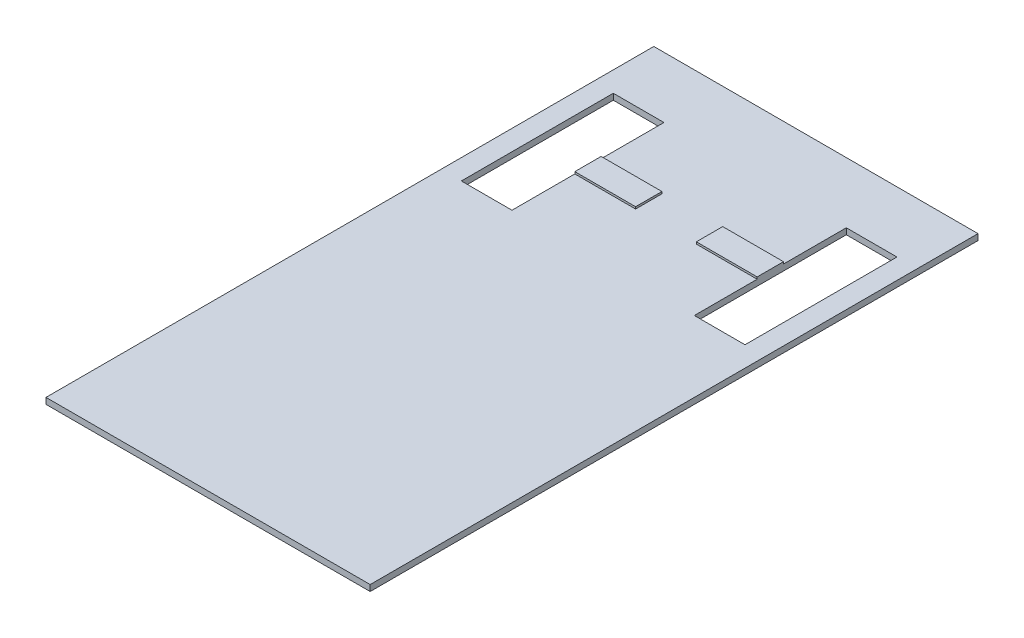
ISO-10303-21;
HEADER;
FILE_DESCRIPTION(('STEP AP214'),'2;1');
FILE_NAME('part.step','',(''),(''),'','','');
FILE_SCHEMA(('AUTOMOTIVE_DESIGN { 1 0 10303 214 1 1 1 1 }'));
ENDSEC;
DATA;
#1=APPLICATION_CONTEXT('core data for automotive mechanical design processes');
#2=APPLICATION_PROTOCOL_DEFINITION('international standard','automotive_design',2000,#1);
#3=PRODUCT_CONTEXT('',#1,'mechanical');
#4=PRODUCT('Part','Part','',(#3));
#5=PRODUCT_RELATED_PRODUCT_CATEGORY('part','',(#4));
#6=PRODUCT_DEFINITION_FORMATION('','',#4);
#7=PRODUCT_DEFINITION_CONTEXT('part definition',#1,'design');
#8=PRODUCT_DEFINITION('design','',#6,#7);
#9=PRODUCT_DEFINITION_SHAPE('','',#8);
#10=(LENGTH_UNIT() NAMED_UNIT(*) SI_UNIT(.MILLI.,.METRE.));
#11=(NAMED_UNIT(*) PLANE_ANGLE_UNIT() SI_UNIT($,.RADIAN.));
#12=(NAMED_UNIT(*) SI_UNIT($,.STERADIAN.) SOLID_ANGLE_UNIT());
#13=UNCERTAINTY_MEASURE_WITH_UNIT(LENGTH_MEASURE(1.E-05),#10,'distance_accuracy_value','');
#14=(GEOMETRIC_REPRESENTATION_CONTEXT(3) GLOBAL_UNCERTAINTY_ASSIGNED_CONTEXT((#13)) GLOBAL_UNIT_ASSIGNED_CONTEXT((#10,
#11,#12)) REPRESENTATION_CONTEXT('',''));
#15=CARTESIAN_POINT('',(0.,0.,0.));
#16=DIRECTION('',(0.,0.,1.));
#17=DIRECTION('',(1.,0.,0.));
#18=AXIS2_PLACEMENT_3D('',#15,#16,#17);
#19=CARTESIAN_POINT('',(2.46516211719598E-13,3.,44.4084127696466));
#20=DIRECTION('',(0.,0.,-1.));
#21=DIRECTION('',(-1.,0.,0.));
#22=AXIS2_PLACEMENT_3D('',#19,#20,#21);
#23=PLANE('',#22);
#24=DIRECTION('',(1.,0.,0.));
#25=VECTOR('',#24,1.);
#26=CARTESIAN_POINT('',(2.46516211719598E-13,0.,44.4084127696466));
#27=LINE('',#26,#25);
#28=CARTESIAN_POINT('',(50.4857649515051,0.,44.4084127696464));
#29=VERTEX_POINT('',#28);
#30=CARTESIAN_POINT('',(75.4857649515051,0.,44.4084127696462));
#31=VERTEX_POINT('',#30);
#32=EDGE_CURVE('E155',#29,#31,#27,.T.);
#33=ORIENTED_EDGE('',*,*,#32,.F.);
#34=DIRECTION('',(0.,-1.,0.));
#35=VECTOR('',#34,1.);
#36=CARTESIAN_POINT('',(50.4857649515051,3.,44.4084127696464));
#37=LINE('',#36,#35);
#38=CARTESIAN_POINT('',(50.4857649515051,3.,44.4084127696464));
#39=VERTEX_POINT('',#38);
#40=EDGE_CURVE('E49',#39,#29,#37,.T.);
#41=ORIENTED_EDGE('',*,*,#40,.F.);
#42=DIRECTION('',(1.,0.,0.));
#43=VECTOR('',#42,1.);
#44=CARTESIAN_POINT('',(2.46516211719598E-13,3.,44.4084127696466));
#45=LINE('',#44,#43);
#46=CARTESIAN_POINT('',(75.4857649515051,3.,44.4084127696462));
#47=VERTEX_POINT('',#46);
#48=EDGE_CURVE('E153',#39,#47,#45,.T.);
#49=ORIENTED_EDGE('',*,*,#48,.T.);
#50=DIRECTION('',(0.,-1.,0.));
#51=VECTOR('',#50,1.);
#52=CARTESIAN_POINT('',(75.4857649515051,3.,44.4084127696462));
#53=LINE('',#52,#51);
#54=EDGE_CURVE('E11',#47,#31,#53,.T.);
#55=ORIENTED_EDGE('',*,*,#54,.T.);
#56=EDGE_LOOP('',(#33,#41,#49,#55));
#57=FACE_BOUND('',#56,.T.);
#58=ADVANCED_FACE('F39',(#57),#23,.T.);
#59=CARTESIAN_POINT('',(50.4857649515051,3.,0.));
#60=DIRECTION('',(1.,0.,0.));
#61=DIRECTION('',(0.,0.,-1.));
#62=AXIS2_PLACEMENT_3D('',#59,#60,#61);
#63=PLANE('',#62);
#64=DIRECTION('',(0.,0.,1.));
#65=VECTOR('',#64,1.);
#66=CARTESIAN_POINT('',(50.4857649515051,0.,0.));
#67=LINE('',#66,#65);
#68=CARTESIAN_POINT('',(50.4857649515051,0.,-30.5915872303536));
#69=VERTEX_POINT('',#68);
#70=EDGE_CURVE('E202',#69,#29,#67,.T.);
#71=ORIENTED_EDGE('',*,*,#70,.F.);
#72=DIRECTION('',(0.,-1.,0.));
#73=VECTOR('',#72,1.);
#74=CARTESIAN_POINT('',(50.4857649515051,3.,-30.5915872303536));
#75=LINE('',#74,#73);
#76=CARTESIAN_POINT('',(50.4857649515051,3.,-30.5915872303536));
#77=VERTEX_POINT('',#76);
#78=EDGE_CURVE('E99',#77,#69,#75,.T.);
#79=ORIENTED_EDGE('',*,*,#78,.F.);
#80=DIRECTION('',(0.,0.,1.));
#81=VECTOR('',#80,1.);
#82=CARTESIAN_POINT('',(50.4857649515051,3.,0.));
#83=LINE('',#82,#81);
#84=EDGE_CURVE('E163',#77,#39,#83,.T.);
#85=ORIENTED_EDGE('',*,*,#84,.T.);
#86=ORIENTED_EDGE('',*,*,#40,.T.);
#87=EDGE_LOOP('',(#71,#79,#85,#86));
#88=FACE_BOUND('',#87,.T.);
#89=ADVANCED_FACE('F169',(#88),#63,.T.);
#90=CARTESIAN_POINT('',(0.,3.,-30.5915872303536));
#91=DIRECTION('',(0.,0.,-1.));
#92=DIRECTION('',(-1.,0.,0.));
#93=AXIS2_PLACEMENT_3D('',#90,#91,#92);
#94=PLANE('',#93);
#95=DIRECTION('',(1.,0.,0.));
#96=VECTOR('',#95,1.);
#97=CARTESIAN_POINT('',(0.,0.,-30.5915872303536));
#98=LINE('',#97,#96);
#99=CARTESIAN_POINT('',(75.4857649515051,0.,-30.5915872303536));
#100=VERTEX_POINT('',#99);
#101=EDGE_CURVE('E102',#69,#100,#98,.T.);
#102=ORIENTED_EDGE('',*,*,#101,.T.);
#103=DIRECTION('',(0.,-1.,0.));
#104=VECTOR('',#103,1.);
#105=CARTESIAN_POINT('',(75.4857649515051,3.,-30.5915872303536));
#106=LINE('',#105,#104);
#107=CARTESIAN_POINT('',(75.4857649515051,3.,-30.5915872303536));
#108=VERTEX_POINT('',#107);
#109=EDGE_CURVE('E205',#108,#100,#106,.T.);
#110=ORIENTED_EDGE('',*,*,#109,.F.);
#111=DIRECTION('',(1.,0.,0.));
#112=VECTOR('',#111,1.);
#113=CARTESIAN_POINT('',(0.,3.,-30.5915872303536));
#114=LINE('',#113,#112);
#115=EDGE_CURVE('E58',#77,#108,#114,.T.);
#116=ORIENTED_EDGE('',*,*,#115,.F.);
#117=ORIENTED_EDGE('',*,*,#78,.T.);
#118=EDGE_LOOP('',(#102,#110,#116,#117));
#119=FACE_BOUND('',#118,.T.);
#120=ADVANCED_FACE('F371',(#119),#94,.F.);
#121=CARTESIAN_POINT('',(200.485764951505,3.,0.));
#122=DIRECTION('',(1.,0.,0.));
#123=DIRECTION('',(0.,0.,-1.));
#124=AXIS2_PLACEMENT_3D('',#121,#122,#123);
#125=PLANE('',#124);
#126=DIRECTION('',(0.,0.,1.));
#127=VECTOR('',#126,1.);
#128=CARTESIAN_POINT('',(200.485764951505,0.,0.));
#129=LINE('',#128,#127);
#130=CARTESIAN_POINT('',(200.485764951505,0.,-60.5915872303536));
#131=VERTEX_POINT('',#130);
#132=CARTESIAN_POINT('',(200.485764951505,0.,239.408412769646));
#133=VERTEX_POINT('',#132);
#134=EDGE_CURVE('E178',#131,#133,#129,.T.);
#135=ORIENTED_EDGE('',*,*,#134,.F.);
#136=DIRECTION('',(0.,-1.,0.));
#137=VECTOR('',#136,1.);
#138=CARTESIAN_POINT('',(200.485764951505,3.,-60.5915872303536));
#139=LINE('',#138,#137);
#140=CARTESIAN_POINT('',(200.485764951505,3.,-60.5915872303536));
#141=VERTEX_POINT('',#140);
#142=EDGE_CURVE('E207',#141,#131,#139,.T.);
#143=ORIENTED_EDGE('',*,*,#142,.F.);
#144=DIRECTION('',(0.,0.,1.));
#145=VECTOR('',#144,1.);
#146=CARTESIAN_POINT('',(200.485764951505,3.,0.));
#147=LINE('',#146,#145);
#148=CARTESIAN_POINT('',(200.485764951505,3.,239.408412769646));
#149=VERTEX_POINT('',#148);
#150=EDGE_CURVE('E256',#141,#149,#147,.T.);
#151=ORIENTED_EDGE('',*,*,#150,.T.);
#152=DIRECTION('',(0.,-1.,0.));
#153=VECTOR('',#152,1.);
#154=CARTESIAN_POINT('',(200.485764951505,3.,239.408412769646));
#155=LINE('',#154,#153);
#156=EDGE_CURVE('E209',#149,#133,#155,.T.);
#157=ORIENTED_EDGE('',*,*,#156,.T.);
#158=EDGE_LOOP('',(#135,#143,#151,#157));
#159=FACE_BOUND('',#158,.T.);
#160=ADVANCED_FACE('F386',(#159),#125,.T.);
#161=CARTESIAN_POINT('',(0.,3.,-60.5915872303536));
#162=DIRECTION('',(0.,0.,-1.));
#163=DIRECTION('',(-1.,0.,0.));
#164=AXIS2_PLACEMENT_3D('',#161,#162,#163);
#165=PLANE('',#164);
#166=DIRECTION('',(1.,0.,0.));
#167=VECTOR('',#166,1.);
#168=CARTESIAN_POINT('',(0.,0.,-60.5915872303536));
#169=LINE('',#168,#167);
#170=CARTESIAN_POINT('',(40.4857649515051,0.,-60.5915872303536));
#171=VERTEX_POINT('',#170);
#172=EDGE_CURVE('E190',#171,#131,#169,.T.);
#173=ORIENTED_EDGE('',*,*,#172,.F.);
#174=DIRECTION('',(0.,-1.,0.));
#175=VECTOR('',#174,1.);
#176=CARTESIAN_POINT('',(40.4857649515051,3.,-60.5915872303536));
#177=LINE('',#176,#175);
#178=CARTESIAN_POINT('',(40.4857649515051,3.,-60.5915872303536));
#179=VERTEX_POINT('',#178);
#180=EDGE_CURVE('E214',#179,#171,#177,.T.);
#181=ORIENTED_EDGE('',*,*,#180,.F.);
#182=DIRECTION('',(1.,0.,0.));
#183=VECTOR('',#182,1.);
#184=CARTESIAN_POINT('',(0.,3.,-60.5915872303536));
#185=LINE('',#184,#183);
#186=EDGE_CURVE('E259',#179,#141,#185,.T.);
#187=ORIENTED_EDGE('',*,*,#186,.T.);
#188=ORIENTED_EDGE('',*,*,#142,.T.);
#189=EDGE_LOOP('',(#173,#181,#187,#188));
#190=FACE_BOUND('',#189,.T.);
#191=ADVANCED_FACE('F382',(#190),#165,.T.);
#192=CARTESIAN_POINT('',(40.4857649515051,3.,0.));
#193=DIRECTION('',(1.,0.,0.));
#194=DIRECTION('',(0.,0.,-1.));
#195=AXIS2_PLACEMENT_3D('',#192,#193,#194);
#196=PLANE('',#195);
#197=DIRECTION('',(0.,0.,1.));
#198=VECTOR('',#197,1.);
#199=CARTESIAN_POINT('',(40.4857649515051,0.,0.));
#200=LINE('',#199,#198);
#201=CARTESIAN_POINT('',(40.4857649515052,0.,239.408412769646));
#202=VERTEX_POINT('',#201);
#203=EDGE_CURVE('E193',#171,#202,#200,.T.);
#204=ORIENTED_EDGE('',*,*,#203,.T.);
#205=DIRECTION('',(0.,-1.,0.));
#206=VECTOR('',#205,1.);
#207=CARTESIAN_POINT('',(40.4857649515052,3.,239.408412769646));
#208=LINE('',#207,#206);
#209=CARTESIAN_POINT('',(40.4857649515052,3.,239.408412769646));
#210=VERTEX_POINT('',#209);
#211=EDGE_CURVE('E211',#210,#202,#208,.T.);
#212=ORIENTED_EDGE('',*,*,#211,.F.);
#213=DIRECTION('',(0.,0.,1.));
#214=VECTOR('',#213,1.);
#215=CARTESIAN_POINT('',(40.4857649515051,3.,0.));
#216=LINE('',#215,#214);
#217=EDGE_CURVE('E262',#179,#210,#216,.T.);
#218=ORIENTED_EDGE('',*,*,#217,.F.);
#219=ORIENTED_EDGE('',*,*,#180,.T.);
#220=EDGE_LOOP('',(#204,#212,#218,#219));
#221=FACE_BOUND('',#220,.T.);
#222=ADVANCED_FACE('F379',(#221),#196,.F.);
#223=CARTESIAN_POINT('',(0.,3.,-30.5915872303536));
#224=DIRECTION('',(0.,0.,-1.));
#225=DIRECTION('',(-1.,0.,0.));
#226=AXIS2_PLACEMENT_3D('',#223,#224,#225);
#227=PLANE('',#226);
#228=DIRECTION('',(1.,0.,0.));
#229=VECTOR('',#228,1.);
#230=CARTESIAN_POINT('',(0.,0.,-30.5915872303536));
#231=LINE('',#230,#229);
#232=CARTESIAN_POINT('',(165.485764951505,0.,-30.5915872303536));
#233=VERTEX_POINT('',#232);
#234=CARTESIAN_POINT('',(190.485764951505,0.,-30.5915872303536));
#235=VERTEX_POINT('',#234);
#236=EDGE_CURVE('E180',#233,#235,#231,.T.);
#237=ORIENTED_EDGE('',*,*,#236,.T.);
#238=DIRECTION('',(0.,-1.,0.));
#239=VECTOR('',#238,1.);
#240=CARTESIAN_POINT('',(190.485764951505,3.,-30.5915872303536));
#241=LINE('',#240,#239);
#242=CARTESIAN_POINT('',(190.485764951505,3.,-30.5915872303536));
#243=VERTEX_POINT('',#242);
#244=EDGE_CURVE('E220',#243,#235,#241,.T.);
#245=ORIENTED_EDGE('',*,*,#244,.F.);
#246=DIRECTION('',(1.,0.,0.));
#247=VECTOR('',#246,1.);
#248=CARTESIAN_POINT('',(0.,3.,-30.5915872303536));
#249=LINE('',#248,#247);
#250=CARTESIAN_POINT('',(165.485764951505,3.,-30.5915872303536));
#251=VERTEX_POINT('',#250);
#252=EDGE_CURVE('E230',#251,#243,#249,.T.);
#253=ORIENTED_EDGE('',*,*,#252,.F.);
#254=DIRECTION('',(0.,-1.,0.));
#255=VECTOR('',#254,1.);
#256=CARTESIAN_POINT('',(165.485764951505,3.,-30.5915872303536));
#257=LINE('',#256,#255);
#258=EDGE_CURVE('E43',#251,#233,#257,.T.);
#259=ORIENTED_EDGE('',*,*,#258,.T.);
#260=EDGE_LOOP('',(#237,#245,#253,#259));
#261=FACE_BOUND('',#260,.T.);
#262=ADVANCED_FACE('F41',(#261),#227,.F.);
#263=CARTESIAN_POINT('',(190.485764951505,3.,0.));
#264=DIRECTION('',(1.,0.,0.));
#265=DIRECTION('',(0.,0.,-1.));
#266=AXIS2_PLACEMENT_3D('',#263,#264,#265);
#267=PLANE('',#266);
#268=DIRECTION('',(0.,0.,1.));
#269=VECTOR('',#268,1.);
#270=CARTESIAN_POINT('',(190.485764951505,0.,0.));
#271=LINE('',#270,#269);
#272=CARTESIAN_POINT('',(190.485764951505,0.,44.4084127696464));
#273=VERTEX_POINT('',#272);
#274=EDGE_CURVE('E182',#235,#273,#271,.T.);
#275=ORIENTED_EDGE('',*,*,#274,.T.);
#276=DIRECTION('',(0.,-1.,0.));
#277=VECTOR('',#276,1.);
#278=CARTESIAN_POINT('',(190.485764951505,3.,44.4084127696464));
#279=LINE('',#278,#277);
#280=CARTESIAN_POINT('',(190.485764951505,3.,44.4084127696464));
#281=VERTEX_POINT('',#280);
#282=EDGE_CURVE('E219',#281,#273,#279,.T.);
#283=ORIENTED_EDGE('',*,*,#282,.F.);
#284=DIRECTION('',(0.,0.,1.));
#285=VECTOR('',#284,1.);
#286=CARTESIAN_POINT('',(190.485764951505,3.,0.));
#287=LINE('',#286,#285);
#288=EDGE_CURVE('E241',#243,#281,#287,.T.);
#289=ORIENTED_EDGE('',*,*,#288,.F.);
#290=ORIENTED_EDGE('',*,*,#244,.T.);
#291=EDGE_LOOP('',(#275,#283,#289,#290));
#292=FACE_BOUND('',#291,.T.);
#293=ADVANCED_FACE('F239',(#292),#267,.F.);
#294=CARTESIAN_POINT('',(0.,3.,44.4084127696464));
#295=DIRECTION('',(0.,0.,-1.));
#296=DIRECTION('',(-1.,0.,0.));
#297=AXIS2_PLACEMENT_3D('',#294,#295,#296);
#298=PLANE('',#297);
#299=DIRECTION('',(1.,0.,0.));
#300=VECTOR('',#299,1.);
#301=CARTESIAN_POINT('',(0.,0.,44.4084127696464));
#302=LINE('',#301,#300);
#303=CARTESIAN_POINT('',(165.485764951505,0.,44.4084127696464));
#304=VERTEX_POINT('',#303);
#305=EDGE_CURVE('E179',#304,#273,#302,.T.);
#306=ORIENTED_EDGE('',*,*,#305,.F.);
#307=DIRECTION('',(0.,-1.,0.));
#308=VECTOR('',#307,1.);
#309=CARTESIAN_POINT('',(165.485764951505,3.,44.4084127696464));
#310=LINE('',#309,#308);
#311=CARTESIAN_POINT('',(165.485764951505,3.,44.4084127696464));
#312=VERTEX_POINT('',#311);
#313=EDGE_CURVE('E217',#312,#304,#310,.T.);
#314=ORIENTED_EDGE('',*,*,#313,.F.);
#315=DIRECTION('',(1.,0.,0.));
#316=VECTOR('',#315,1.);
#317=CARTESIAN_POINT('',(0.,3.,44.4084127696464));
#318=LINE('',#317,#316);
#319=EDGE_CURVE('E244',#312,#281,#318,.T.);
#320=ORIENTED_EDGE('',*,*,#319,.T.);
#321=ORIENTED_EDGE('',*,*,#282,.T.);
#322=EDGE_LOOP('',(#306,#314,#320,#321));
#323=FACE_BOUND('',#322,.T.);
#324=ADVANCED_FACE('F245',(#323),#298,.T.);
#325=CARTESIAN_POINT('',(165.485764951505,3.,0.));
#326=DIRECTION('',(1.,0.,0.));
#327=DIRECTION('',(0.,0.,-1.));
#328=AXIS2_PLACEMENT_3D('',#325,#326,#327);
#329=PLANE('',#328);
#330=DIRECTION('',(0.,0.,1.));
#331=VECTOR('',#330,1.);
#332=CARTESIAN_POINT('',(165.485764951505,0.,0.));
#333=LINE('',#332,#331);
#334=EDGE_CURVE('E175',#233,#304,#333,.T.);
#335=ORIENTED_EDGE('',*,*,#334,.F.);
#336=ORIENTED_EDGE('',*,*,#258,.F.);
#337=DIRECTION('',(0.,0.,1.));
#338=VECTOR('',#337,1.);
#339=CARTESIAN_POINT('',(165.485764951505,3.,0.));
#340=LINE('',#339,#338);
#341=CARTESIAN_POINT('',(165.485764951505,3.,0.408412769646361));
#342=VERTEX_POINT('',#341);
#343=EDGE_CURVE('E251',#251,#342,#340,.T.);
#344=ORIENTED_EDGE('',*,*,#343,.T.);
#345=DIRECTION('',(0.,-1.,0.));
#346=VECTOR('',#345,1.);
#347=CARTESIAN_POINT('',(165.485764951505,4.,0.408412769646361));
#348=LINE('',#347,#346);
#349=CARTESIAN_POINT('',(165.485764951505,4.,0.408412769646361));
#350=VERTEX_POINT('',#349);
#351=EDGE_CURVE('E309',#350,#342,#348,.T.);
#352=ORIENTED_EDGE('',*,*,#351,.F.);
#353=DIRECTION('',(0.,0.,1.));
#354=VECTOR('',#353,1.);
#355=CARTESIAN_POINT('',(165.485764951505,4.,0.));
#356=LINE('',#355,#354);
#357=CARTESIAN_POINT('',(165.485764951505,4.,13.4084127696464));
#358=VERTEX_POINT('',#357);
#359=EDGE_CURVE('E319',#350,#358,#356,.T.);
#360=ORIENTED_EDGE('',*,*,#359,.T.);
#361=DIRECTION('',(0.,-1.,0.));
#362=VECTOR('',#361,1.);
#363=CARTESIAN_POINT('',(165.485764951505,4.,13.4084127696464));
#364=LINE('',#363,#362);
#365=CARTESIAN_POINT('',(165.485764951505,3.,13.4084127696464));
#366=VERTEX_POINT('',#365);
#367=EDGE_CURVE('E318',#358,#366,#364,.T.);
#368=ORIENTED_EDGE('',*,*,#367,.T.);
#369=EDGE_CURVE('E247',#366,#312,#340,.T.);
#370=ORIENTED_EDGE('',*,*,#369,.T.);
#371=ORIENTED_EDGE('',*,*,#313,.T.);
#372=EDGE_LOOP('',(#335,#336,#344,#352,#360,#368,#370,#371));
#373=FACE_BOUND('',#372,.T.);
#374=ADVANCED_FACE('F306',(#373),#329,.T.);
#375=CARTESIAN_POINT('',(0.,3.,239.408412769646));
#376=DIRECTION('',(0.,0.,-1.));
#377=DIRECTION('',(-1.,0.,0.));
#378=AXIS2_PLACEMENT_3D('',#375,#376,#377);
#379=PLANE('',#378);
#380=DIRECTION('',(1.,0.,0.));
#381=VECTOR('',#380,1.);
#382=CARTESIAN_POINT('',(0.,0.,239.408412769646));
#383=LINE('',#382,#381);
#384=EDGE_CURVE('E196',#202,#133,#383,.T.);
#385=ORIENTED_EDGE('',*,*,#384,.T.);
#386=ORIENTED_EDGE('',*,*,#156,.F.);
#387=DIRECTION('',(1.,0.,0.));
#388=VECTOR('',#387,1.);
#389=CARTESIAN_POINT('',(0.,3.,239.408412769646));
#390=LINE('',#389,#388);
#391=EDGE_CURVE('E265',#210,#149,#390,.T.);
#392=ORIENTED_EDGE('',*,*,#391,.F.);
#393=ORIENTED_EDGE('',*,*,#211,.T.);
#394=EDGE_LOOP('',(#385,#386,#392,#393));
#395=FACE_BOUND('',#394,.T.);
#396=ADVANCED_FACE('F375',(#395),#379,.F.);
#397=CARTESIAN_POINT('',(75.4857649515051,3.,0.));
#398=DIRECTION('',(1.,0.,0.));
#399=DIRECTION('',(0.,0.,-1.));
#400=AXIS2_PLACEMENT_3D('',#397,#398,#399);
#401=PLANE('',#400);
#402=DIRECTION('',(0.,0.,1.));
#403=VECTOR('',#402,1.);
#404=CARTESIAN_POINT('',(75.4857649515051,0.,0.));
#405=LINE('',#404,#403);
#406=EDGE_CURVE('E199',#100,#31,#405,.T.);
#407=ORIENTED_EDGE('',*,*,#406,.T.);
#408=ORIENTED_EDGE('',*,*,#54,.F.);
#409=DIRECTION('',(0.,0.,1.));
#410=VECTOR('',#409,1.);
#411=CARTESIAN_POINT('',(75.4857649515051,3.,0.));
#412=LINE('',#411,#410);
#413=CARTESIAN_POINT('',(75.4857649515051,3.,13.4084127696463));
#414=VERTEX_POINT('',#413);
#415=EDGE_CURVE('E166',#414,#47,#412,.T.);
#416=ORIENTED_EDGE('',*,*,#415,.F.);
#417=DIRECTION('',(0.,-1.,0.));
#418=VECTOR('',#417,1.);
#419=CARTESIAN_POINT('',(75.4857649515051,4.,13.4084127696463));
#420=LINE('',#419,#418);
#421=CARTESIAN_POINT('',(75.4857649515051,4.,13.4084127696463));
#422=VERTEX_POINT('',#421);
#423=EDGE_CURVE('E292',#422,#414,#420,.T.);
#424=ORIENTED_EDGE('',*,*,#423,.F.);
#425=DIRECTION('',(0.,0.,1.));
#426=VECTOR('',#425,1.);
#427=CARTESIAN_POINT('',(75.4857649515051,4.,0.));
#428=LINE('',#427,#426);
#429=CARTESIAN_POINT('',(75.4857649515051,4.,0.40841276964629));
#430=VERTEX_POINT('',#429);
#431=EDGE_CURVE('E288',#430,#422,#428,.T.);
#432=ORIENTED_EDGE('',*,*,#431,.F.);
#433=DIRECTION('',(0.,-1.,0.));
#434=VECTOR('',#433,1.);
#435=CARTESIAN_POINT('',(75.4857649515051,4.,0.40841276964629));
#436=LINE('',#435,#434);
#437=CARTESIAN_POINT('',(75.4857649515051,3.,0.40841276964629));
#438=VERTEX_POINT('',#437);
#439=EDGE_CURVE('E284',#430,#438,#436,.T.);
#440=ORIENTED_EDGE('',*,*,#439,.T.);
#441=EDGE_CURVE('E171',#108,#438,#412,.T.);
#442=ORIENTED_EDGE('',*,*,#441,.F.);
#443=ORIENTED_EDGE('',*,*,#109,.T.);
#444=EDGE_LOOP('',(#407,#408,#416,#424,#432,#440,#442,#443));
#445=FACE_BOUND('',#444,.T.);
#446=ADVANCED_FACE('F280',(#445),#401,.F.);
#447=CARTESIAN_POINT('',(0.,3.,0.));
#448=DIRECTION('',(0.,1.,0.));
#449=DIRECTION('',(0.,0.,1.));
#450=AXIS2_PLACEMENT_3D('',#447,#448,#449);
#451=PLANE('',#450);
#452=DIRECTION('',(0.,0.,1.));
#453=VECTOR('',#452,1.);
#454=CARTESIAN_POINT('',(135.485764951505,3.,0.));
#455=LINE('',#454,#453);
#456=CARTESIAN_POINT('',(135.485764951505,3.,0.408412769646359));
#457=VERTEX_POINT('',#456);
#458=CARTESIAN_POINT('',(135.485764951505,3.,13.4084127696464));
#459=VERTEX_POINT('',#458);
#460=EDGE_CURVE('E111',#457,#459,#455,.T.);
#461=ORIENTED_EDGE('',*,*,#460,.F.);
#462=DIRECTION('',(-1.,0.,0.));
#463=VECTOR('',#462,1.);
#464=CARTESIAN_POINT('',(0.,3.,0.408412769646343));
#465=LINE('',#464,#463);
#466=EDGE_CURVE('E302',#342,#457,#465,.T.);
#467=ORIENTED_EDGE('',*,*,#466,.F.);
#468=ORIENTED_EDGE('',*,*,#343,.F.);
#469=ORIENTED_EDGE('',*,*,#252,.T.);
#470=ORIENTED_EDGE('',*,*,#288,.T.);
#471=ORIENTED_EDGE('',*,*,#319,.F.);
#472=ORIENTED_EDGE('',*,*,#369,.F.);
#473=DIRECTION('',(-1.,0.,0.));
#474=VECTOR('',#473,1.);
#475=CARTESIAN_POINT('',(0.,3.,13.4084127696464));
#476=LINE('',#475,#474);
#477=EDGE_CURVE('E249',#366,#459,#476,.T.);
#478=ORIENTED_EDGE('',*,*,#477,.T.);
#479=EDGE_LOOP('',(#461,#467,#468,#469,#470,#471,#472,#478));
#480=FACE_BOUND('',#479,.T.);
#481=ORIENTED_EDGE('',*,*,#150,.F.);
#482=ORIENTED_EDGE('',*,*,#186,.F.);
#483=ORIENTED_EDGE('',*,*,#217,.T.);
#484=ORIENTED_EDGE('',*,*,#391,.T.);
#485=EDGE_LOOP('',(#481,#482,#483,#484));
#486=FACE_BOUND('',#485,.T.);
#487=DIRECTION('',(1.,0.,0.));
#488=VECTOR('',#487,1.);
#489=CARTESIAN_POINT('',(0.,3.,0.408412769646311));
#490=LINE('',#489,#488);
#491=CARTESIAN_POINT('',(105.485764951505,3.,0.408412769646286));
#492=VERTEX_POINT('',#491);
#493=EDGE_CURVE('E267',#438,#492,#490,.T.);
#494=ORIENTED_EDGE('',*,*,#493,.T.);
#495=DIRECTION('',(0.,0.,1.));
#496=VECTOR('',#495,1.);
#497=CARTESIAN_POINT('',(105.485764951505,3.,0.));
#498=LINE('',#497,#496);
#499=CARTESIAN_POINT('',(105.485764951505,3.,13.4084127696463));
#500=VERTEX_POINT('',#499);
#501=EDGE_CURVE('E269',#492,#500,#498,.T.);
#502=ORIENTED_EDGE('',*,*,#501,.T.);
#503=DIRECTION('',(1.,0.,0.));
#504=VECTOR('',#503,1.);
#505=CARTESIAN_POINT('',(0.,3.,13.4084127696463));
#506=LINE('',#505,#504);
#507=EDGE_CURVE('E272',#414,#500,#506,.T.);
#508=ORIENTED_EDGE('',*,*,#507,.F.);
#509=ORIENTED_EDGE('',*,*,#415,.T.);
#510=ORIENTED_EDGE('',*,*,#48,.F.);
#511=ORIENTED_EDGE('',*,*,#84,.F.);
#512=ORIENTED_EDGE('',*,*,#115,.T.);
#513=ORIENTED_EDGE('',*,*,#441,.T.);
#514=EDGE_LOOP('',(#494,#502,#508,#509,#510,#511,#512,#513));
#515=FACE_BOUND('',#514,.T.);
#516=ADVANCED_FACE('F162',(#480,#486,#515),#451,.T.);
#517=CARTESIAN_POINT('',(0.,0.,0.));
#518=DIRECTION('',(0.,1.,0.));
#519=DIRECTION('',(0.,0.,1.));
#520=AXIS2_PLACEMENT_3D('',#517,#518,#519);
#521=PLANE('',#520);
#522=ORIENTED_EDGE('',*,*,#236,.F.);
#523=ORIENTED_EDGE('',*,*,#334,.T.);
#524=ORIENTED_EDGE('',*,*,#305,.T.);
#525=ORIENTED_EDGE('',*,*,#274,.F.);
#526=EDGE_LOOP('',(#522,#523,#524,#525));
#527=FACE_BOUND('',#526,.T.);
#528=ORIENTED_EDGE('',*,*,#134,.T.);
#529=ORIENTED_EDGE('',*,*,#384,.F.);
#530=ORIENTED_EDGE('',*,*,#203,.F.);
#531=ORIENTED_EDGE('',*,*,#172,.T.);
#532=EDGE_LOOP('',(#528,#529,#530,#531));
#533=FACE_BOUND('',#532,.T.);
#534=ORIENTED_EDGE('',*,*,#32,.T.);
#535=ORIENTED_EDGE('',*,*,#406,.F.);
#536=ORIENTED_EDGE('',*,*,#101,.F.);
#537=ORIENTED_EDGE('',*,*,#70,.T.);
#538=EDGE_LOOP('',(#534,#535,#536,#537));
#539=FACE_BOUND('',#538,.T.);
#540=ADVANCED_FACE('F235',(#527,#533,#539),#521,.F.);
#541=CARTESIAN_POINT('',(105.485764951505,4.,0.));
#542=DIRECTION('',(1.,0.,0.));
#543=DIRECTION('',(0.,0.,-1.));
#544=AXIS2_PLACEMENT_3D('',#541,#542,#543);
#545=PLANE('',#544);
#546=DIRECTION('',(0.,-1.,0.));
#547=VECTOR('',#546,1.);
#548=CARTESIAN_POINT('',(105.485764951505,4.,13.4084127696463));
#549=LINE('',#548,#547);
#550=CARTESIAN_POINT('',(105.485764951505,4.,13.4084127696463));
#551=VERTEX_POINT('',#550);
#552=EDGE_CURVE('E297',#551,#500,#549,.T.);
#553=ORIENTED_EDGE('',*,*,#552,.T.);
#554=ORIENTED_EDGE('',*,*,#501,.F.);
#555=DIRECTION('',(0.,-1.,0.));
#556=VECTOR('',#555,1.);
#557=CARTESIAN_POINT('',(105.485764951505,4.,0.408412769646286));
#558=LINE('',#557,#556);
#559=CARTESIAN_POINT('',(105.485764951505,4.,0.408412769646286));
#560=VERTEX_POINT('',#559);
#561=EDGE_CURVE('E183',#560,#492,#558,.T.);
#562=ORIENTED_EDGE('',*,*,#561,.F.);
#563=DIRECTION('',(0.,0.,1.));
#564=VECTOR('',#563,1.);
#565=CARTESIAN_POINT('',(105.485764951505,4.,0.));
#566=LINE('',#565,#564);
#567=EDGE_CURVE('E332',#560,#551,#566,.T.);
#568=ORIENTED_EDGE('',*,*,#567,.T.);
#569=EDGE_LOOP('',(#553,#554,#562,#568));
#570=FACE_BOUND('',#569,.T.);
#571=ADVANCED_FACE('F345',(#570),#545,.T.);
#572=CARTESIAN_POINT('',(0.,4.,0.408412769646311));
#573=DIRECTION('',(0.,0.,-1.));
#574=DIRECTION('',(-1.,0.,0.));
#575=AXIS2_PLACEMENT_3D('',#572,#573,#574);
#576=PLANE('',#575);
#577=ORIENTED_EDGE('',*,*,#561,.T.);
#578=ORIENTED_EDGE('',*,*,#493,.F.);
#579=ORIENTED_EDGE('',*,*,#439,.F.);
#580=DIRECTION('',(1.,0.,0.));
#581=VECTOR('',#580,1.);
#582=CARTESIAN_POINT('',(0.,4.,0.408412769646311));
#583=LINE('',#582,#581);
#584=EDGE_CURVE('E335',#430,#560,#583,.T.);
#585=ORIENTED_EDGE('',*,*,#584,.T.);
#586=EDGE_LOOP('',(#577,#578,#579,#585));
#587=FACE_BOUND('',#586,.T.);
#588=ADVANCED_FACE('F362',(#587),#576,.T.);
#589=CARTESIAN_POINT('',(0.,4.,13.4084127696463));
#590=DIRECTION('',(0.,0.,-1.));
#591=DIRECTION('',(-1.,0.,0.));
#592=AXIS2_PLACEMENT_3D('',#589,#590,#591);
#593=PLANE('',#592);
#594=ORIENTED_EDGE('',*,*,#507,.T.);
#595=ORIENTED_EDGE('',*,*,#552,.F.);
#596=DIRECTION('',(1.,0.,0.));
#597=VECTOR('',#596,1.);
#598=CARTESIAN_POINT('',(0.,4.,13.4084127696463));
#599=LINE('',#598,#597);
#600=EDGE_CURVE('E338',#422,#551,#599,.T.);
#601=ORIENTED_EDGE('',*,*,#600,.F.);
#602=ORIENTED_EDGE('',*,*,#423,.T.);
#603=EDGE_LOOP('',(#594,#595,#601,#602));
#604=FACE_BOUND('',#603,.T.);
#605=ADVANCED_FACE('F353',(#604),#593,.F.);
#606=CARTESIAN_POINT('',(0.,4.,0.));
#607=DIRECTION('',(0.,1.,0.));
#608=DIRECTION('',(0.,0.,1.));
#609=AXIS2_PLACEMENT_3D('',#606,#607,#608);
#610=PLANE('',#609);
#611=ORIENTED_EDGE('',*,*,#567,.F.);
#612=ORIENTED_EDGE('',*,*,#584,.F.);
#613=ORIENTED_EDGE('',*,*,#431,.T.);
#614=ORIENTED_EDGE('',*,*,#600,.T.);
#615=EDGE_LOOP('',(#611,#612,#613,#614));
#616=FACE_BOUND('',#615,.T.);
#617=ADVANCED_FACE('F515',(#616),#610,.T.);
#618=CARTESIAN_POINT('',(0.,4.,0.408412769646343));
#619=DIRECTION('',(0.,0.,1.));
#620=DIRECTION('',(1.,0.,0.));
#621=AXIS2_PLACEMENT_3D('',#618,#619,#620);
#622=PLANE('',#621);
#623=ORIENTED_EDGE('',*,*,#466,.T.);
#624=DIRECTION('',(0.,-1.,0.));
#625=VECTOR('',#624,1.);
#626=CARTESIAN_POINT('',(135.485764951505,4.,0.408412769646359));
#627=LINE('',#626,#625);
#628=CARTESIAN_POINT('',(135.485764951505,4.,0.408412769646359));
#629=VERTEX_POINT('',#628);
#630=EDGE_CURVE('E330',#629,#457,#627,.T.);
#631=ORIENTED_EDGE('',*,*,#630,.F.);
#632=DIRECTION('',(-1.,0.,0.));
#633=VECTOR('',#632,1.);
#634=CARTESIAN_POINT('',(0.,4.,0.408412769646343));
#635=LINE('',#634,#633);
#636=EDGE_CURVE('E316',#350,#629,#635,.T.);
#637=ORIENTED_EDGE('',*,*,#636,.F.);
#638=ORIENTED_EDGE('',*,*,#351,.T.);
#639=EDGE_LOOP('',(#623,#631,#637,#638));
#640=FACE_BOUND('',#639,.T.);
#641=ADVANCED_FACE('F312',(#640),#622,.F.);
#642=CARTESIAN_POINT('',(135.485764951505,4.,0.));
#643=DIRECTION('',(1.,0.,0.));
#644=DIRECTION('',(0.,0.,-1.));
#645=AXIS2_PLACEMENT_3D('',#642,#643,#644);
#646=PLANE('',#645);
#647=ORIENTED_EDGE('',*,*,#460,.T.);
#648=DIRECTION('',(0.,-1.,0.));
#649=VECTOR('',#648,1.);
#650=CARTESIAN_POINT('',(135.485764951505,4.,13.4084127696464));
#651=LINE('',#650,#649);
#652=CARTESIAN_POINT('',(135.485764951505,4.,13.4084127696464));
#653=VERTEX_POINT('',#652);
#654=EDGE_CURVE('E322',#653,#459,#651,.T.);
#655=ORIENTED_EDGE('',*,*,#654,.F.);
#656=DIRECTION('',(0.,0.,1.));
#657=VECTOR('',#656,1.);
#658=CARTESIAN_POINT('',(135.485764951505,4.,0.));
#659=LINE('',#658,#657);
#660=EDGE_CURVE('E621',#629,#653,#659,.T.);
#661=ORIENTED_EDGE('',*,*,#660,.F.);
#662=ORIENTED_EDGE('',*,*,#630,.T.);
#663=EDGE_LOOP('',(#647,#655,#661,#662));
#664=FACE_BOUND('',#663,.T.);
#665=ADVANCED_FACE('F533',(#664),#646,.F.);
#666=CARTESIAN_POINT('',(0.,4.,13.4084127696464));
#667=DIRECTION('',(0.,0.,1.));
#668=DIRECTION('',(1.,0.,0.));
#669=AXIS2_PLACEMENT_3D('',#666,#667,#668);
#670=PLANE('',#669);
#671=ORIENTED_EDGE('',*,*,#654,.T.);
#672=ORIENTED_EDGE('',*,*,#477,.F.);
#673=ORIENTED_EDGE('',*,*,#367,.F.);
#674=DIRECTION('',(-1.,0.,0.));
#675=VECTOR('',#674,1.);
#676=CARTESIAN_POINT('',(0.,4.,13.4084127696464));
#677=LINE('',#676,#675);
#678=EDGE_CURVE('E324',#358,#653,#677,.T.);
#679=ORIENTED_EDGE('',*,*,#678,.T.);
#680=EDGE_LOOP('',(#671,#672,#673,#679));
#681=FACE_BOUND('',#680,.T.);
#682=ADVANCED_FACE('F542',(#681),#670,.T.);
#683=CARTESIAN_POINT('',(0.,4.,0.));
#684=DIRECTION('',(0.,1.,0.));
#685=DIRECTION('',(0.,0.,1.));
#686=AXIS2_PLACEMENT_3D('',#683,#684,#685);
#687=PLANE('',#686);
#688=ORIENTED_EDGE('',*,*,#636,.T.);
#689=ORIENTED_EDGE('',*,*,#660,.T.);
#690=ORIENTED_EDGE('',*,*,#678,.F.);
#691=ORIENTED_EDGE('',*,*,#359,.F.);
#692=EDGE_LOOP('',(#688,#689,#690,#691));
#693=FACE_BOUND('',#692,.T.);
#694=ADVANCED_FACE('F552',(#693),#687,.T.);
#695=CLOSED_SHELL('',(#58,#89,#120,#160,#191,#222,#262,#293,#324,#374,#396,#446,#516,#540,#571,
#588,#605,#617,#641,#665,#682,#694));
#696=MANIFOLD_SOLID_BREP('B2',#695);
#697=ADVANCED_BREP_SHAPE_REPRESENTATION('',(#18,#696),#14);
#698=SHAPE_DEFINITION_REPRESENTATION(#9,#697);
ENDSEC;
END-ISO-10303-21;
